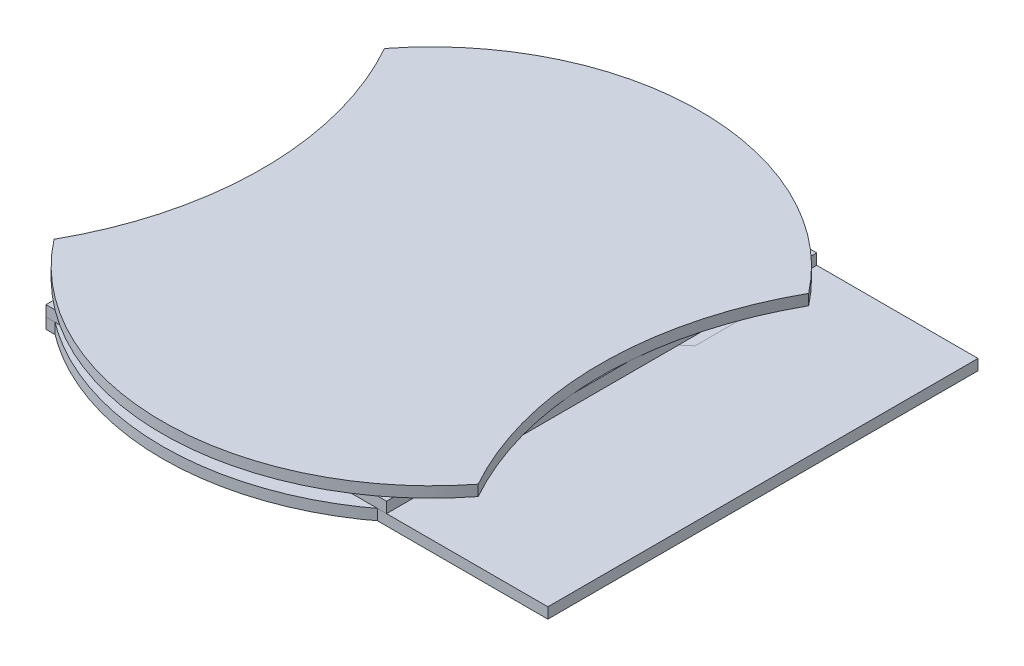
ISO-10303-21;
HEADER;
FILE_DESCRIPTION(('STEP AP214'),'2;1');
FILE_NAME('part.step','',(''),(''),'','','');
FILE_SCHEMA(('AUTOMOTIVE_DESIGN { 1 0 10303 214 1 1 1 1 }'));
ENDSEC;
DATA;
#1=APPLICATION_CONTEXT('core data for automotive mechanical design processes');
#2=APPLICATION_PROTOCOL_DEFINITION('international standard','automotive_design',2000,#1);
#3=PRODUCT_CONTEXT('',#1,'mechanical');
#4=PRODUCT('Part','Part','',(#3));
#5=PRODUCT_RELATED_PRODUCT_CATEGORY('part','',(#4));
#6=PRODUCT_DEFINITION_FORMATION('','',#4);
#7=PRODUCT_DEFINITION_CONTEXT('part definition',#1,'design');
#8=PRODUCT_DEFINITION('design','',#6,#7);
#9=PRODUCT_DEFINITION_SHAPE('','',#8);
#10=(LENGTH_UNIT() NAMED_UNIT(*) SI_UNIT(.MILLI.,.METRE.));
#11=(NAMED_UNIT(*) PLANE_ANGLE_UNIT() SI_UNIT($,.RADIAN.));
#12=(NAMED_UNIT(*) SI_UNIT($,.STERADIAN.) SOLID_ANGLE_UNIT());
#13=UNCERTAINTY_MEASURE_WITH_UNIT(LENGTH_MEASURE(1.E-05),#10,'distance_accuracy_value','');
#14=(GEOMETRIC_REPRESENTATION_CONTEXT(3) GLOBAL_UNCERTAINTY_ASSIGNED_CONTEXT((#13)) GLOBAL_UNIT_ASSIGNED_CONTEXT((#10,
#11,#12)) REPRESENTATION_CONTEXT('',''));
#15=CARTESIAN_POINT('',(0.,0.,0.));
#16=DIRECTION('',(0.,0.,1.));
#17=DIRECTION('',(1.,0.,0.));
#18=AXIS2_PLACEMENT_3D('',#15,#16,#17);
#19=CARTESIAN_POINT('',(47.5,3.,-60.));
#20=DIRECTION('',(0.,-1.,0.));
#21=DIRECTION('',(0.,0.,-1.));
#22=AXIS2_PLACEMENT_3D('',#19,#20,#21);
#23=PLANE('',#22);
#24=CARTESIAN_POINT('',(76.9611123026038,3.,-19.6014497550547));
#25=DIRECTION('',(0.,1.,0.));
#26=DIRECTION('',(0.,0.,1.));
#27=AXIS2_PLACEMENT_3D('',#24,#25,#26);
#28=CIRCLE('',#27,1.50000000000001);
#29=CARTESIAN_POINT('',(76.9611123026038,3.,-18.1014497550547));
#30=VERTEX_POINT('',#29);
#31=EDGE_CURVE('E173',#30,#30,#28,.T.);
#32=ORIENTED_EDGE('',*,*,#31,.F.);
#33=EDGE_LOOP('',(#32));
#34=FACE_BOUND('',#33,.T.);
#35=CARTESIAN_POINT('',(76.9611123026038,3.,-100.398550244945));
#36=DIRECTION('',(0.,1.,0.));
#37=DIRECTION('',(0.,0.,1.));
#38=AXIS2_PLACEMENT_3D('',#35,#36,#37);
#39=CIRCLE('',#38,1.50000000000001);
#40=CARTESIAN_POINT('',(76.9611123026038,3.,-98.8985502449453));
#41=VERTEX_POINT('',#40);
#42=EDGE_CURVE('E128',#41,#41,#39,.F.);
#43=ORIENTED_EDGE('',*,*,#42,.T.);
#44=EDGE_LOOP('',(#43));
#45=FACE_BOUND('',#44,.T.);
#46=CARTESIAN_POINT('',(87.5000000000002,3.,-15.15));
#47=DIRECTION('',(0.,1.,0.));
#48=DIRECTION('',(0.,0.,1.));
#49=AXIS2_PLACEMENT_3D('',#46,#47,#48);
#50=CIRCLE('',#49,1.50000000000001);
#51=CARTESIAN_POINT('',(87.5000000000002,3.,-13.65));
#52=VERTEX_POINT('',#51);
#53=EDGE_CURVE('E163',#52,#52,#50,.T.);
#54=ORIENTED_EDGE('',*,*,#53,.F.);
#55=EDGE_LOOP('',(#54));
#56=FACE_BOUND('',#55,.T.);
#57=CARTESIAN_POINT('',(87.5000000000002,3.,-104.85));
#58=DIRECTION('',(0.,1.,0.));
#59=DIRECTION('',(0.,0.,1.));
#60=AXIS2_PLACEMENT_3D('',#57,#58,#59);
#61=CIRCLE('',#60,1.50000000000001);
#62=CARTESIAN_POINT('',(87.5000000000002,3.,-103.35));
#63=VERTEX_POINT('',#62);
#64=EDGE_CURVE('E114',#63,#63,#61,.F.);
#65=ORIENTED_EDGE('',*,*,#64,.T.);
#66=EDGE_LOOP('',(#65));
#67=FACE_BOUND('',#66,.T.);
#68=CARTESIAN_POINT('',(47.5,3.,-60.));
#69=DIRECTION('',(0.,1.,0.));
#70=DIRECTION('',(0.,0.,1.));
#71=AXIS2_PLACEMENT_3D('',#68,#69,#70);
#72=CIRCLE('',#71,25.);
#73=CARTESIAN_POINT('',(47.5,3.,-35.));
#74=VERTEX_POINT('',#73);
#75=EDGE_CURVE('E102',#74,#74,#72,.T.);
#76=ORIENTED_EDGE('',*,*,#75,.F.);
#77=EDGE_LOOP('',(#76));
#78=FACE_BOUND('',#77,.T.);
#79=CARTESIAN_POINT('',(7.49999999999987,3.,-15.15));
#80=DIRECTION('',(0.,1.,0.));
#81=DIRECTION('',(0.,0.,1.));
#82=AXIS2_PLACEMENT_3D('',#79,#80,#81);
#83=CIRCLE('',#82,1.5);
#84=CARTESIAN_POINT('',(7.49999999999987,3.,-13.65));
#85=VERTEX_POINT('',#84);
#86=EDGE_CURVE('E166',#85,#85,#83,.F.);
#87=ORIENTED_EDGE('',*,*,#86,.T.);
#88=EDGE_LOOP('',(#87));
#89=FACE_BOUND('',#88,.T.);
#90=CARTESIAN_POINT('',(7.49999999999987,3.,-104.85));
#91=DIRECTION('',(0.,1.,0.));
#92=DIRECTION('',(0.,0.,1.));
#93=AXIS2_PLACEMENT_3D('',#90,#91,#92);
#94=CIRCLE('',#93,1.5);
#95=CARTESIAN_POINT('',(7.49999999999987,3.,-103.35));
#96=VERTEX_POINT('',#95);
#97=EDGE_CURVE('E137',#96,#96,#94,.T.);
#98=ORIENTED_EDGE('',*,*,#97,.F.);
#99=EDGE_LOOP('',(#98));
#100=FACE_BOUND('',#99,.T.);
#101=CARTESIAN_POINT('',(18.0388876973963,3.,-19.6014497550547));
#102=DIRECTION('',(0.,1.,0.));
#103=DIRECTION('',(0.,0.,1.));
#104=AXIS2_PLACEMENT_3D('',#101,#102,#103);
#105=CIRCLE('',#104,1.5);
#106=CARTESIAN_POINT('',(18.0388876973963,3.,-18.1014497550547));
#107=VERTEX_POINT('',#106);
#108=EDGE_CURVE('E176',#107,#107,#105,.F.);
#109=ORIENTED_EDGE('',*,*,#108,.T.);
#110=EDGE_LOOP('',(#109));
#111=FACE_BOUND('',#110,.T.);
#112=CARTESIAN_POINT('',(18.0388876973963,3.,-100.398550244945));
#113=DIRECTION('',(0.,1.,0.));
#114=DIRECTION('',(0.,0.,1.));
#115=AXIS2_PLACEMENT_3D('',#112,#113,#114);
#116=CIRCLE('',#115,1.5);
#117=CARTESIAN_POINT('',(18.0388876973963,3.,-98.8985502449453));
#118=VERTEX_POINT('',#117);
#119=EDGE_CURVE('E146',#118,#118,#116,.T.);
#120=ORIENTED_EDGE('',*,*,#119,.F.);
#121=EDGE_LOOP('',(#120));
#122=FACE_BOUND('',#121,.T.);
#123=DIRECTION('',(0.,0.,1.));
#124=VECTOR('',#123,1.);
#125=CARTESIAN_POINT('',(-2.49999999999997,3.,0.));
#126=LINE('',#125,#124);
#127=CARTESIAN_POINT('',(-2.49999999999997,3.,-115.901699437495));
#128=VERTEX_POINT('',#127);
#129=CARTESIAN_POINT('',(-2.49999999999997,3.,-4.09830056250528));
#130=VERTEX_POINT('',#129);
#131=EDGE_CURVE('E62',#128,#130,#126,.T.);
#132=ORIENTED_EDGE('',*,*,#131,.T.);
#133=CARTESIAN_POINT('',(47.5,3.,-60.));
#134=DIRECTION('',(0.,-1.,0.));
#135=DIRECTION('',(0.,0.,-1.));
#136=AXIS2_PLACEMENT_3D('',#133,#134,#135);
#137=CIRCLE('',#136,75.);
#138=CARTESIAN_POINT('',(97.5,3.,-4.09830056250528));
#139=VERTEX_POINT('',#138);
#140=EDGE_CURVE('E96',#139,#130,#137,.T.);
#141=ORIENTED_EDGE('',*,*,#140,.F.);
#142=DIRECTION('',(0.,0.,-1.));
#143=VECTOR('',#142,1.);
#144=CARTESIAN_POINT('',(97.5,3.,0.));
#145=LINE('',#144,#143);
#146=CARTESIAN_POINT('',(97.5,3.,-115.901699437495));
#147=VERTEX_POINT('',#146);
#148=EDGE_CURVE('E70',#139,#147,#145,.T.);
#149=ORIENTED_EDGE('',*,*,#148,.T.);
#150=EDGE_CURVE('E98',#128,#147,#137,.T.);
#151=ORIENTED_EDGE('',*,*,#150,.F.);
#152=EDGE_LOOP('',(#132,#141,#149,#151));
#153=FACE_BOUND('',#152,.T.);
#154=ADVANCED_FACE('F48',(#34,#45,#56,#67,#78,#89,#100,#111,#122,#153),#23,.F.);
#155=CARTESIAN_POINT('',(47.5,0.,-60.));
#156=DIRECTION('',(0.,-1.,0.));
#157=DIRECTION('',(0.,0.,-1.));
#158=AXIS2_PLACEMENT_3D('',#155,#156,#157);
#159=PLANE('',#158);
#160=CARTESIAN_POINT('',(18.0388876973963,0.,-19.6014497550547));
#161=DIRECTION('',(0.,-1.,0.));
#162=DIRECTION('',(0.,0.,-1.));
#163=AXIS2_PLACEMENT_3D('',#160,#161,#162);
#164=CIRCLE('',#163,1.5);
#165=CARTESIAN_POINT('',(18.0388876973963,0.,-21.1014497550547));
#166=VERTEX_POINT('',#165);
#167=EDGE_CURVE('E131',#166,#166,#164,.F.);
#168=ORIENTED_EDGE('',*,*,#167,.T.);
#169=EDGE_LOOP('',(#168));
#170=FACE_BOUND('',#169,.T.);
#171=CARTESIAN_POINT('',(76.9611123026038,0.,-100.398550244945));
#172=DIRECTION('',(0.,-1.,0.));
#173=DIRECTION('',(0.,0.,-1.));
#174=AXIS2_PLACEMENT_3D('',#171,#172,#173);
#175=CIRCLE('',#174,1.50000000000001);
#176=CARTESIAN_POINT('',(76.9611123026038,0.,-101.898550244945));
#177=VERTEX_POINT('',#176);
#178=EDGE_CURVE('E124',#177,#177,#175,.F.);
#179=ORIENTED_EDGE('',*,*,#178,.T.);
#180=EDGE_LOOP('',(#179));
#181=FACE_BOUND('',#180,.T.);
#182=CARTESIAN_POINT('',(7.49999999999987,0.,-15.15));
#183=DIRECTION('',(0.,-1.,0.));
#184=DIRECTION('',(0.,0.,-1.));
#185=AXIS2_PLACEMENT_3D('',#182,#183,#184);
#186=CIRCLE('',#185,1.5);
#187=CARTESIAN_POINT('',(7.49999999999987,0.,-16.65));
#188=VERTEX_POINT('',#187);
#189=EDGE_CURVE('E117',#188,#188,#186,.F.);
#190=ORIENTED_EDGE('',*,*,#189,.T.);
#191=EDGE_LOOP('',(#190));
#192=FACE_BOUND('',#191,.T.);
#193=CARTESIAN_POINT('',(87.5000000000002,0.,-104.85));
#194=DIRECTION('',(0.,-1.,0.));
#195=DIRECTION('',(0.,0.,-1.));
#196=AXIS2_PLACEMENT_3D('',#193,#194,#195);
#197=CIRCLE('',#196,1.50000000000001);
#198=CARTESIAN_POINT('',(87.5000000000002,0.,-106.35));
#199=VERTEX_POINT('',#198);
#200=EDGE_CURVE('E110',#199,#199,#197,.F.);
#201=ORIENTED_EDGE('',*,*,#200,.T.);
#202=EDGE_LOOP('',(#201));
#203=FACE_BOUND('',#202,.T.);
#204=CARTESIAN_POINT('',(87.5000000000002,0.,-15.15));
#205=DIRECTION('',(0.,-1.,0.));
#206=DIRECTION('',(0.,0.,-1.));
#207=AXIS2_PLACEMENT_3D('',#204,#205,#206);
#208=CIRCLE('',#207,1.50000000000001);
#209=CARTESIAN_POINT('',(87.5000000000002,0.,-16.65));
#210=VERTEX_POINT('',#209);
#211=EDGE_CURVE('E113',#210,#210,#208,.T.);
#212=ORIENTED_EDGE('',*,*,#211,.F.);
#213=EDGE_LOOP('',(#212));
#214=FACE_BOUND('',#213,.T.);
#215=CARTESIAN_POINT('',(7.49999999999987,0.,-104.85));
#216=DIRECTION('',(0.,-1.,0.));
#217=DIRECTION('',(0.,0.,-1.));
#218=AXIS2_PLACEMENT_3D('',#215,#216,#217);
#219=CIRCLE('',#218,1.5);
#220=CARTESIAN_POINT('',(7.49999999999987,0.,-106.35));
#221=VERTEX_POINT('',#220);
#222=EDGE_CURVE('E120',#221,#221,#219,.T.);
#223=ORIENTED_EDGE('',*,*,#222,.F.);
#224=EDGE_LOOP('',(#223));
#225=FACE_BOUND('',#224,.T.);
#226=CARTESIAN_POINT('',(76.9611123026038,0.,-19.6014497550547));
#227=DIRECTION('',(0.,-1.,0.));
#228=DIRECTION('',(0.,0.,-1.));
#229=AXIS2_PLACEMENT_3D('',#226,#227,#228);
#230=CIRCLE('',#229,1.50000000000001);
#231=CARTESIAN_POINT('',(76.9611123026038,0.,-21.1014497550547));
#232=VERTEX_POINT('',#231);
#233=EDGE_CURVE('E127',#232,#232,#230,.T.);
#234=ORIENTED_EDGE('',*,*,#233,.F.);
#235=EDGE_LOOP('',(#234));
#236=FACE_BOUND('',#235,.T.);
#237=CARTESIAN_POINT('',(18.0388876973963,0.,-100.398550244945));
#238=DIRECTION('',(0.,-1.,0.));
#239=DIRECTION('',(0.,0.,-1.));
#240=AXIS2_PLACEMENT_3D('',#237,#238,#239);
#241=CIRCLE('',#240,1.5);
#242=CARTESIAN_POINT('',(18.0388876973963,0.,-101.898550244945));
#243=VERTEX_POINT('',#242);
#244=EDGE_CURVE('E134',#243,#243,#241,.T.);
#245=ORIENTED_EDGE('',*,*,#244,.F.);
#246=EDGE_LOOP('',(#245));
#247=FACE_BOUND('',#246,.T.);
#248=CARTESIAN_POINT('',(47.5,0.,-60.));
#249=DIRECTION('',(0.,-1.,0.));
#250=DIRECTION('',(0.,0.,-1.));
#251=AXIS2_PLACEMENT_3D('',#248,#249,#250);
#252=CIRCLE('',#251,75.);
#253=CARTESIAN_POINT('',(97.5,0.,-4.09830056250528));
#254=VERTEX_POINT('',#253);
#255=CARTESIAN_POINT('',(-2.49999999999997,0.,-4.09830056250528));
#256=VERTEX_POINT('',#255);
#257=EDGE_CURVE('E106',#254,#256,#252,.T.);
#258=ORIENTED_EDGE('',*,*,#257,.T.);
#259=DIRECTION('',(0.,0.,-1.));
#260=VECTOR('',#259,1.);
#261=CARTESIAN_POINT('',(-2.49999999999997,0.,-60.));
#262=LINE('',#261,#260);
#263=CARTESIAN_POINT('',(-2.49999999999997,0.,-115.901699437495));
#264=VERTEX_POINT('',#263);
#265=EDGE_CURVE('E88',#256,#264,#262,.T.);
#266=ORIENTED_EDGE('',*,*,#265,.T.);
#267=CARTESIAN_POINT('',(97.5,0.,-115.901699437495));
#268=VERTEX_POINT('',#267);
#269=EDGE_CURVE('E109',#264,#268,#252,.T.);
#270=ORIENTED_EDGE('',*,*,#269,.T.);
#271=DIRECTION('',(0.,0.,1.));
#272=VECTOR('',#271,1.);
#273=CARTESIAN_POINT('',(97.5,0.,-60.));
#274=LINE('',#273,#272);
#275=EDGE_CURVE('E99',#268,#254,#274,.T.);
#276=ORIENTED_EDGE('',*,*,#275,.T.);
#277=EDGE_LOOP('',(#258,#266,#270,#276));
#278=FACE_BOUND('',#277,.T.);
#279=ADVANCED_FACE('F144',(#170,#181,#192,#203,#214,#225,#236,#247,#278),#159,.T.);
#280=CARTESIAN_POINT('',(47.5,0.,-60.));
#281=DIRECTION('',(0.,1.,0.));
#282=DIRECTION('',(0.,0.,1.));
#283=AXIS2_PLACEMENT_3D('',#280,#281,#282);
#284=CYLINDRICAL_SURFACE('',#283,75.);
#285=DIRECTION('',(0.,1.,0.));
#286=VECTOR('',#285,1.);
#287=CARTESIAN_POINT('',(-2.49999999999997,0.,-4.09830056250528));
#288=LINE('',#287,#286);
#289=EDGE_CURVE('E12',#256,#130,#288,.T.);
#290=ORIENTED_EDGE('',*,*,#289,.F.);
#291=ORIENTED_EDGE('',*,*,#257,.F.);
#292=DIRECTION('',(0.,1.,0.));
#293=VECTOR('',#292,1.);
#294=CARTESIAN_POINT('',(97.5,0.,-4.09830056250528));
#295=LINE('',#294,#293);
#296=EDGE_CURVE('E101',#139,#254,#295,.F.);
#297=ORIENTED_EDGE('',*,*,#296,.F.);
#298=ORIENTED_EDGE('',*,*,#140,.T.);
#299=EDGE_LOOP('',(#290,#291,#297,#298));
#300=FACE_BOUND('',#299,.T.);
#301=ADVANCED_FACE('F50',(#300),#284,.T.);
#302=DIRECTION('',(0.,1.,0.));
#303=VECTOR('',#302,1.);
#304=CARTESIAN_POINT('',(-2.49999999999997,0.,-115.901699437495));
#305=LINE('',#304,#303);
#306=EDGE_CURVE('E56',#128,#264,#305,.F.);
#307=ORIENTED_EDGE('',*,*,#306,.F.);
#308=ORIENTED_EDGE('',*,*,#150,.T.);
#309=DIRECTION('',(0.,1.,0.));
#310=VECTOR('',#309,1.);
#311=CARTESIAN_POINT('',(97.5,0.,-115.901699437495));
#312=LINE('',#311,#310);
#313=EDGE_CURVE('E139',#268,#147,#312,.T.);
#314=ORIENTED_EDGE('',*,*,#313,.F.);
#315=ORIENTED_EDGE('',*,*,#269,.F.);
#316=EDGE_LOOP('',(#307,#308,#314,#315));
#317=FACE_BOUND('',#316,.T.);
#318=ADVANCED_FACE('F149',(#317),#284,.T.);
#319=CARTESIAN_POINT('',(47.5,8.,-60.));
#320=DIRECTION('',(0.,1.,0.));
#321=DIRECTION('',(0.,0.,1.));
#322=AXIS2_PLACEMENT_3D('',#319,#320,#321);
#323=PLANE('',#322);
#324=CARTESIAN_POINT('',(47.5,8.,-60.));
#325=DIRECTION('',(0.,1.,0.));
#326=DIRECTION('',(0.,0.,1.));
#327=AXIS2_PLACEMENT_3D('',#324,#325,#326);
#328=CIRCLE('',#327,25.);
#329=CARTESIAN_POINT('',(47.5,8.,-35.));
#330=VERTEX_POINT('',#329);
#331=EDGE_CURVE('E150',#330,#330,#328,.T.);
#332=ORIENTED_EDGE('',*,*,#331,.T.);
#333=EDGE_LOOP('',(#332));
#334=FACE_BOUND('',#333,.T.);
#335=CARTESIAN_POINT('',(47.5,8.,-60.));
#336=DIRECTION('',(0.,1.,0.));
#337=DIRECTION('',(0.,0.,1.));
#338=AXIS2_PLACEMENT_3D('',#335,#336,#337);
#339=CIRCLE('',#338,8.35);
#340=CARTESIAN_POINT('',(47.5,8.,-51.65));
#341=VERTEX_POINT('',#340);
#342=EDGE_CURVE('E152',#341,#341,#339,.T.);
#343=ORIENTED_EDGE('',*,*,#342,.F.);
#344=EDGE_LOOP('',(#343));
#345=FACE_BOUND('',#344,.T.);
#346=ADVANCED_FACE('F224',(#334,#345),#323,.T.);
#347=CARTESIAN_POINT('',(47.5,8.,-60.));
#348=DIRECTION('',(0.,-1.,0.));
#349=DIRECTION('',(0.,0.,-1.));
#350=AXIS2_PLACEMENT_3D('',#347,#348,#349);
#351=CYLINDRICAL_SURFACE('',#350,25.);
#352=ORIENTED_EDGE('',*,*,#331,.F.);
#353=EDGE_LOOP('',(#352));
#354=FACE_BOUND('',#353,.T.);
#355=ORIENTED_EDGE('',*,*,#75,.T.);
#356=EDGE_LOOP('',(#355));
#357=FACE_BOUND('',#356,.T.);
#358=ADVANCED_FACE('F216',(#354,#357),#351,.T.);
#359=CARTESIAN_POINT('',(47.5,8.,-60.));
#360=DIRECTION('',(0.,-1.,0.));
#361=DIRECTION('',(0.,0.,-1.));
#362=AXIS2_PLACEMENT_3D('',#359,#360,#361);
#363=CYLINDRICAL_SURFACE('',#362,8.35);
#364=ORIENTED_EDGE('',*,*,#342,.T.);
#365=EDGE_LOOP('',(#364));
#366=FACE_BOUND('',#365,.T.);
#367=CARTESIAN_POINT('',(47.5,3.,-60.));
#368=DIRECTION('',(0.,1.,0.));
#369=DIRECTION('',(0.,0.,1.));
#370=AXIS2_PLACEMENT_3D('',#367,#368,#369);
#371=CIRCLE('',#370,8.35);
#372=CARTESIAN_POINT('',(47.5,3.,-51.65));
#373=VERTEX_POINT('',#372);
#374=EDGE_CURVE('E123',#373,#373,#371,.T.);
#375=ORIENTED_EDGE('',*,*,#374,.F.);
#376=EDGE_LOOP('',(#375));
#377=FACE_BOUND('',#376,.T.);
#378=ADVANCED_FACE('F207',(#366,#377),#363,.F.);
#379=ORIENTED_EDGE('',*,*,#374,.T.);
#380=EDGE_LOOP('',(#379));
#381=FACE_BOUND('',#380,.T.);
#382=ADVANCED_FACE('F197',(#381),#23,.F.);
#383=CARTESIAN_POINT('',(87.5000000000002,-7.,-104.85));
#384=DIRECTION('',(0.,1.,0.));
#385=DIRECTION('',(0.,0.,1.));
#386=AXIS2_PLACEMENT_3D('',#383,#384,#385);
#387=CYLINDRICAL_SURFACE('',#386,1.50000000000001);
#388=ORIENTED_EDGE('',*,*,#200,.F.);
#389=EDGE_LOOP('',(#388));
#390=FACE_BOUND('',#389,.T.);
#391=ORIENTED_EDGE('',*,*,#64,.F.);
#392=EDGE_LOOP('',(#391));
#393=FACE_BOUND('',#392,.T.);
#394=ADVANCED_FACE('F206',(#390,#393),#387,.F.);
#395=CARTESIAN_POINT('',(87.5000000000002,-7.,-15.15));
#396=DIRECTION('',(0.,1.,0.));
#397=DIRECTION('',(0.,0.,1.));
#398=AXIS2_PLACEMENT_3D('',#395,#396,#397);
#399=CYLINDRICAL_SURFACE('',#398,1.50000000000001);
#400=ORIENTED_EDGE('',*,*,#211,.T.);
#401=EDGE_LOOP('',(#400));
#402=FACE_BOUND('',#401,.T.);
#403=ORIENTED_EDGE('',*,*,#53,.T.);
#404=EDGE_LOOP('',(#403));
#405=FACE_BOUND('',#404,.T.);
#406=ADVANCED_FACE('F213',(#402,#405),#399,.F.);
#407=CARTESIAN_POINT('',(7.49999999999987,-7.,-15.15));
#408=DIRECTION('',(0.,1.,0.));
#409=DIRECTION('',(0.,0.,1.));
#410=AXIS2_PLACEMENT_3D('',#407,#408,#409);
#411=CYLINDRICAL_SURFACE('',#410,1.5);
#412=ORIENTED_EDGE('',*,*,#189,.F.);
#413=EDGE_LOOP('',(#412));
#414=FACE_BOUND('',#413,.T.);
#415=ORIENTED_EDGE('',*,*,#86,.F.);
#416=EDGE_LOOP('',(#415));
#417=FACE_BOUND('',#416,.T.);
#418=ADVANCED_FACE('F297',(#414,#417),#411,.F.);
#419=CARTESIAN_POINT('',(7.49999999999987,-7.,-104.85));
#420=DIRECTION('',(0.,1.,0.));
#421=DIRECTION('',(0.,0.,1.));
#422=AXIS2_PLACEMENT_3D('',#419,#420,#421);
#423=CYLINDRICAL_SURFACE('',#422,1.5);
#424=ORIENTED_EDGE('',*,*,#222,.T.);
#425=EDGE_LOOP('',(#424));
#426=FACE_BOUND('',#425,.T.);
#427=ORIENTED_EDGE('',*,*,#97,.T.);
#428=EDGE_LOOP('',(#427));
#429=FACE_BOUND('',#428,.T.);
#430=ADVANCED_FACE('F287',(#426,#429),#423,.F.);
#431=CARTESIAN_POINT('',(76.9611123026038,-7.,-100.398550244945));
#432=DIRECTION('',(0.,1.,0.));
#433=DIRECTION('',(0.,0.,1.));
#434=AXIS2_PLACEMENT_3D('',#431,#432,#433);
#435=CYLINDRICAL_SURFACE('',#434,1.50000000000001);
#436=ORIENTED_EDGE('',*,*,#178,.F.);
#437=EDGE_LOOP('',(#436));
#438=FACE_BOUND('',#437,.T.);
#439=ORIENTED_EDGE('',*,*,#42,.F.);
#440=EDGE_LOOP('',(#439));
#441=FACE_BOUND('',#440,.T.);
#442=ADVANCED_FACE('F278',(#438,#441),#435,.F.);
#443=CARTESIAN_POINT('',(76.9611123026038,-7.,-19.6014497550547));
#444=DIRECTION('',(0.,1.,0.));
#445=DIRECTION('',(0.,0.,1.));
#446=AXIS2_PLACEMENT_3D('',#443,#444,#445);
#447=CYLINDRICAL_SURFACE('',#446,1.50000000000001);
#448=ORIENTED_EDGE('',*,*,#233,.T.);
#449=EDGE_LOOP('',(#448));
#450=FACE_BOUND('',#449,.T.);
#451=ORIENTED_EDGE('',*,*,#31,.T.);
#452=EDGE_LOOP('',(#451));
#453=FACE_BOUND('',#452,.T.);
#454=ADVANCED_FACE('F268',(#450,#453),#447,.F.);
#455=CARTESIAN_POINT('',(18.0388876973963,-7.,-19.6014497550547));
#456=DIRECTION('',(0.,1.,0.));
#457=DIRECTION('',(0.,0.,1.));
#458=AXIS2_PLACEMENT_3D('',#455,#456,#457);
#459=CYLINDRICAL_SURFACE('',#458,1.5);
#460=ORIENTED_EDGE('',*,*,#167,.F.);
#461=EDGE_LOOP('',(#460));
#462=FACE_BOUND('',#461,.T.);
#463=ORIENTED_EDGE('',*,*,#108,.F.);
#464=EDGE_LOOP('',(#463));
#465=FACE_BOUND('',#464,.T.);
#466=ADVANCED_FACE('F191',(#462,#465),#459,.F.);
#467=CARTESIAN_POINT('',(18.0388876973963,-7.,-100.398550244945));
#468=DIRECTION('',(0.,1.,0.));
#469=DIRECTION('',(0.,0.,1.));
#470=AXIS2_PLACEMENT_3D('',#467,#468,#469);
#471=CYLINDRICAL_SURFACE('',#470,1.5);
#472=ORIENTED_EDGE('',*,*,#244,.T.);
#473=EDGE_LOOP('',(#472));
#474=FACE_BOUND('',#473,.T.);
#475=ORIENTED_EDGE('',*,*,#119,.T.);
#476=EDGE_LOOP('',(#475));
#477=FACE_BOUND('',#476,.T.);
#478=ADVANCED_FACE('F184',(#474,#477),#471,.F.);
#479=CARTESIAN_POINT('',(97.5,-7.,0.));
#480=DIRECTION('',(1.,0.,0.));
#481=DIRECTION('',(0.,0.,-1.));
#482=AXIS2_PLACEMENT_3D('',#479,#480,#481);
#483=PLANE('',#482);
#484=ORIENTED_EDGE('',*,*,#313,.T.);
#485=ORIENTED_EDGE('',*,*,#148,.F.);
#486=ORIENTED_EDGE('',*,*,#296,.T.);
#487=ORIENTED_EDGE('',*,*,#275,.F.);
#488=EDGE_LOOP('',(#484,#485,#486,#487));
#489=FACE_BOUND('',#488,.T.);
#490=ADVANCED_FACE('F182',(#489),#483,.T.);
#491=CARTESIAN_POINT('',(-2.49999999999997,-7.,0.));
#492=DIRECTION('',(-1.,0.,0.));
#493=DIRECTION('',(0.,0.,1.));
#494=AXIS2_PLACEMENT_3D('',#491,#492,#493);
#495=PLANE('',#494);
#496=ORIENTED_EDGE('',*,*,#289,.T.);
#497=ORIENTED_EDGE('',*,*,#131,.F.);
#498=ORIENTED_EDGE('',*,*,#306,.T.);
#499=ORIENTED_EDGE('',*,*,#265,.F.);
#500=EDGE_LOOP('',(#496,#497,#498,#499));
#501=FACE_BOUND('',#500,.T.);
#502=ADVANCED_FACE('F86',(#501),#495,.T.);
#503=CLOSED_SHELL('',(#154,#279,#301,#318,#346,#358,#378,#382,#394,#406,#418,#430,#442,#454,
#466,#478,#490,#502));
#504=MANIFOLD_SOLID_BREP('B2',#503);
#505=CARTESIAN_POINT('',(47.5,9.,-60.));
#506=DIRECTION('',(0.,-1.,0.));
#507=DIRECTION('',(0.,0.,-1.));
#508=AXIS2_PLACEMENT_3D('',#505,#506,#507);
#509=CYLINDRICAL_SURFACE('',#508,75.);
#510=CARTESIAN_POINT('',(47.5,6.,-60.));
#511=DIRECTION('',(0.,1.,0.));
#512=DIRECTION('',(0.,0.,1.));
#513=AXIS2_PLACEMENT_3D('',#510,#511,#512);
#514=CIRCLE('',#513,75.);
#515=CARTESIAN_POINT('',(106.66,6.,-106.098746186854));
#516=VERTEX_POINT('',#515);
#517=CARTESIAN_POINT('',(-11.66,6.,-106.098746186854));
#518=VERTEX_POINT('',#517);
#519=EDGE_CURVE('E504',#516,#518,#514,.T.);
#520=ORIENTED_EDGE('',*,*,#519,.T.);
#521=DIRECTION('',(0.,1.,0.));
#522=VECTOR('',#521,1.);
#523=CARTESIAN_POINT('',(-11.66,0.,-106.098746186854));
#524=LINE('',#523,#522);
#525=CARTESIAN_POINT('',(-11.66,9.,-106.098746186854));
#526=VERTEX_POINT('',#525);
#527=EDGE_CURVE('E463',#518,#526,#524,.T.);
#528=ORIENTED_EDGE('',*,*,#527,.T.);
#529=CARTESIAN_POINT('',(47.5,9.,-60.));
#530=DIRECTION('',(0.,1.,0.));
#531=DIRECTION('',(0.,0.,1.));
#532=AXIS2_PLACEMENT_3D('',#529,#530,#531);
#533=CIRCLE('',#532,75.);
#534=CARTESIAN_POINT('',(106.66,9.,-106.098746186854));
#535=VERTEX_POINT('',#534);
#536=EDGE_CURVE('E502',#535,#526,#533,.T.);
#537=ORIENTED_EDGE('',*,*,#536,.F.);
#538=DIRECTION('',(0.,1.,0.));
#539=VECTOR('',#538,1.);
#540=CARTESIAN_POINT('',(106.66,0.,-106.098746186854));
#541=LINE('',#540,#539);
#542=EDGE_CURVE('E510',#516,#535,#541,.T.);
#543=ORIENTED_EDGE('',*,*,#542,.F.);
#544=EDGE_LOOP('',(#520,#528,#537,#543));
#545=FACE_BOUND('',#544,.T.);
#546=ADVANCED_FACE('F448',(#545),#509,.T.);
#547=CARTESIAN_POINT('',(-11.66,9.,-13.9012538131458));
#548=VERTEX_POINT('',#547);
#549=CARTESIAN_POINT('',(106.66,9.,-13.9012538131458));
#550=VERTEX_POINT('',#549);
#551=EDGE_CURVE('E500',#548,#550,#533,.T.);
#552=ORIENTED_EDGE('',*,*,#551,.F.);
#553=DIRECTION('',(0.,1.,0.));
#554=VECTOR('',#553,1.);
#555=CARTESIAN_POINT('',(-11.66,0.,-13.9012538131458));
#556=LINE('',#555,#554);
#557=CARTESIAN_POINT('',(-11.66,6.,-13.9012538131458));
#558=VERTEX_POINT('',#557);
#559=EDGE_CURVE('E486',#558,#548,#556,.T.);
#560=ORIENTED_EDGE('',*,*,#559,.F.);
#561=CARTESIAN_POINT('',(106.66,6.,-13.9012538131458));
#562=VERTEX_POINT('',#561);
#563=EDGE_CURVE('E507',#558,#562,#514,.T.);
#564=ORIENTED_EDGE('',*,*,#563,.T.);
#565=DIRECTION('',(0.,1.,0.));
#566=VECTOR('',#565,1.);
#567=CARTESIAN_POINT('',(106.66,0.,-13.9012538131458));
#568=LINE('',#567,#566);
#569=EDGE_CURVE('E470',#562,#550,#568,.T.);
#570=ORIENTED_EDGE('',*,*,#569,.T.);
#571=EDGE_LOOP('',(#552,#560,#564,#570));
#572=FACE_BOUND('',#571,.T.);
#573=ADVANCED_FACE('F450',(#572),#509,.T.);
#574=CARTESIAN_POINT('',(47.5,9.,-60.));
#575=DIRECTION('',(0.,1.,0.));
#576=DIRECTION('',(0.,0.,1.));
#577=AXIS2_PLACEMENT_3D('',#574,#575,#576);
#578=PLANE('',#577);
#579=CARTESIAN_POINT('',(-94.126810840622,9.,-60.));
#580=DIRECTION('',(0.,1.,0.));
#581=DIRECTION('',(0.,0.,-1.));
#582=AXIS2_PLACEMENT_3D('',#579,#580,#581);
#583=CIRCLE('',#582,94.4768187981736);
#584=EDGE_CURVE('E489',#548,#526,#583,.T.);
#585=ORIENTED_EDGE('',*,*,#584,.F.);
#586=ORIENTED_EDGE('',*,*,#551,.T.);
#587=CARTESIAN_POINT('',(189.126810840622,9.,-60.));
#588=DIRECTION('',(0.,1.,0.));
#589=DIRECTION('',(0.,0.,1.));
#590=AXIS2_PLACEMENT_3D('',#587,#588,#589);
#591=CIRCLE('',#590,94.4768187981736);
#592=EDGE_CURVE('E518',#535,#550,#591,.T.);
#593=ORIENTED_EDGE('',*,*,#592,.F.);
#594=ORIENTED_EDGE('',*,*,#536,.T.);
#595=EDGE_LOOP('',(#585,#586,#593,#594));
#596=FACE_BOUND('',#595,.T.);
#597=ADVANCED_FACE('F498',(#596),#578,.T.);
#598=CARTESIAN_POINT('',(47.5,6.,-60.));
#599=DIRECTION('',(0.,1.,0.));
#600=DIRECTION('',(0.,0.,1.));
#601=AXIS2_PLACEMENT_3D('',#598,#599,#600);
#602=PLANE('',#601);
#603=ORIENTED_EDGE('',*,*,#563,.F.);
#604=CARTESIAN_POINT('',(-94.126810840622,6.,-60.));
#605=DIRECTION('',(0.,1.,0.));
#606=DIRECTION('',(0.,0.,1.));
#607=AXIS2_PLACEMENT_3D('',#604,#605,#606);
#608=CIRCLE('',#607,94.4768187981736);
#609=EDGE_CURVE('E46',#558,#518,#608,.T.);
#610=ORIENTED_EDGE('',*,*,#609,.T.);
#611=ORIENTED_EDGE('',*,*,#519,.F.);
#612=CARTESIAN_POINT('',(189.126810840622,6.,-60.));
#613=DIRECTION('',(0.,1.,0.));
#614=DIRECTION('',(0.,0.,1.));
#615=AXIS2_PLACEMENT_3D('',#612,#613,#614);
#616=CIRCLE('',#615,94.4768187981736);
#617=EDGE_CURVE('E456',#516,#562,#616,.T.);
#618=ORIENTED_EDGE('',*,*,#617,.T.);
#619=EDGE_LOOP('',(#603,#610,#611,#618));
#620=FACE_BOUND('',#619,.T.);
#621=ADVANCED_FACE('F514',(#620),#602,.F.);
#622=CARTESIAN_POINT('',(189.126810840622,0.,-60.));
#623=DIRECTION('',(0.,1.,0.));
#624=DIRECTION('',(0.,0.,1.));
#625=AXIS2_PLACEMENT_3D('',#622,#623,#624);
#626=CYLINDRICAL_SURFACE('',#625,94.4768187981736);
#627=ORIENTED_EDGE('',*,*,#542,.T.);
#628=ORIENTED_EDGE('',*,*,#592,.T.);
#629=ORIENTED_EDGE('',*,*,#569,.F.);
#630=ORIENTED_EDGE('',*,*,#617,.F.);
#631=EDGE_LOOP('',(#627,#628,#629,#630));
#632=FACE_BOUND('',#631,.T.);
#633=ADVANCED_FACE('F516',(#632),#626,.F.);
#634=CARTESIAN_POINT('',(-94.126810840622,0.,-60.));
#635=DIRECTION('',(0.,1.,0.));
#636=DIRECTION('',(0.,0.,1.));
#637=AXIS2_PLACEMENT_3D('',#634,#635,#636);
#638=CYLINDRICAL_SURFACE('',#637,94.4768187981736);
#639=ORIENTED_EDGE('',*,*,#559,.T.);
#640=ORIENTED_EDGE('',*,*,#584,.T.);
#641=ORIENTED_EDGE('',*,*,#527,.F.);
#642=ORIENTED_EDGE('',*,*,#609,.F.);
#643=EDGE_LOOP('',(#639,#640,#641,#642));
#644=FACE_BOUND('',#643,.T.);
#645=ADVANCED_FACE('F488',(#644),#638,.F.);
#646=CLOSED_SHELL('',(#546,#573,#597,#621,#633,#645));
#647=MANIFOLD_SOLID_BREP('B6_NOT_SHOWN',#646);
#648=CARTESIAN_POINT('',(0.,6.,-120.));
#649=DIRECTION('',(1.,0.,0.));
#650=DIRECTION('',(0.,0.,-1.));
#651=AXIS2_PLACEMENT_3D('',#648,#649,#650);
#652=PLANE('',#651);
#653=DIRECTION('',(0.,0.,1.));
#654=VECTOR('',#653,1.);
#655=CARTESIAN_POINT('',(0.,3.,-120.));
#656=LINE('',#655,#654);
#657=CARTESIAN_POINT('',(0.,3.,-120.));
#658=VERTEX_POINT('',#657);
#659=CARTESIAN_POINT('',(0.,3.,0.));
#660=VERTEX_POINT('',#659);
#661=EDGE_CURVE('E641',#658,#660,#656,.T.);
#662=ORIENTED_EDGE('',*,*,#661,.T.);
#663=DIRECTION('',(0.,-1.,0.));
#664=VECTOR('',#663,1.);
#665=CARTESIAN_POINT('',(0.,6.,0.));
#666=LINE('',#665,#664);
#667=CARTESIAN_POINT('',(0.,6.,0.));
#668=VERTEX_POINT('',#667);
#669=EDGE_CURVE('E446',#668,#660,#666,.T.);
#670=ORIENTED_EDGE('',*,*,#669,.F.);
#671=DIRECTION('',(0.,0.,1.));
#672=VECTOR('',#671,1.);
#673=CARTESIAN_POINT('',(0.,6.,-120.));
#674=LINE('',#673,#672);
#675=CARTESIAN_POINT('',(0.,6.,-120.));
#676=VERTEX_POINT('',#675);
#677=EDGE_CURVE('E629',#676,#668,#674,.T.);
#678=ORIENTED_EDGE('',*,*,#677,.F.);
#679=DIRECTION('',(0.,-1.,0.));
#680=VECTOR('',#679,1.);
#681=CARTESIAN_POINT('',(0.,6.,-120.));
#682=LINE('',#681,#680);
#683=EDGE_CURVE('E637',#676,#658,#682,.T.);
#684=ORIENTED_EDGE('',*,*,#683,.T.);
#685=EDGE_LOOP('',(#662,#670,#678,#684));
#686=FACE_BOUND('',#685,.T.);
#687=ADVANCED_FACE('F578',(#686),#652,.F.);
#688=CARTESIAN_POINT('',(0.,6.,0.));
#689=DIRECTION('',(0.,0.,-1.));
#690=DIRECTION('',(-1.,0.,0.));
#691=AXIS2_PLACEMENT_3D('',#688,#689,#690);
#692=PLANE('',#691);
#693=DIRECTION('',(1.,0.,0.));
#694=VECTOR('',#693,1.);
#695=CARTESIAN_POINT('',(0.,3.,0.));
#696=LINE('',#695,#694);
#697=CARTESIAN_POINT('',(95.,3.,0.));
#698=VERTEX_POINT('',#697);
#699=EDGE_CURVE('E633',#660,#698,#696,.T.);
#700=ORIENTED_EDGE('',*,*,#699,.T.);
#701=DIRECTION('',(0.,-1.,0.));
#702=VECTOR('',#701,1.);
#703=CARTESIAN_POINT('',(95.,6.,0.));
#704=LINE('',#703,#702);
#705=CARTESIAN_POINT('',(95.,6.,0.));
#706=VERTEX_POINT('',#705);
#707=EDGE_CURVE('E586',#706,#698,#704,.T.);
#708=ORIENTED_EDGE('',*,*,#707,.F.);
#709=DIRECTION('',(1.,0.,0.));
#710=VECTOR('',#709,1.);
#711=CARTESIAN_POINT('',(0.,6.,0.));
#712=LINE('',#711,#710);
#713=EDGE_CURVE('E624',#668,#706,#712,.T.);
#714=ORIENTED_EDGE('',*,*,#713,.F.);
#715=ORIENTED_EDGE('',*,*,#669,.T.);
#716=EDGE_LOOP('',(#700,#708,#714,#715));
#717=FACE_BOUND('',#716,.T.);
#718=ADVANCED_FACE('F632',(#717),#692,.F.);
#719=CARTESIAN_POINT('',(95.,6.,-120.));
#720=DIRECTION('',(-1.,0.,0.));
#721=DIRECTION('',(0.,0.,1.));
#722=AXIS2_PLACEMENT_3D('',#719,#720,#721);
#723=PLANE('',#722);
#724=DIRECTION('',(0.,0.,-1.));
#725=VECTOR('',#724,1.);
#726=CARTESIAN_POINT('',(95.,3.,-120.));
#727=LINE('',#726,#725);
#728=CARTESIAN_POINT('',(95.,3.,-120.));
#729=VERTEX_POINT('',#728);
#730=EDGE_CURVE('E611',#698,#729,#727,.T.);
#731=ORIENTED_EDGE('',*,*,#730,.T.);
#732=DIRECTION('',(0.,-1.,0.));
#733=VECTOR('',#732,1.);
#734=CARTESIAN_POINT('',(95.,6.,-120.));
#735=LINE('',#734,#733);
#736=CARTESIAN_POINT('',(95.,6.,-120.));
#737=VERTEX_POINT('',#736);
#738=EDGE_CURVE('E634',#737,#729,#735,.T.);
#739=ORIENTED_EDGE('',*,*,#738,.F.);
#740=DIRECTION('',(0.,0.,-1.));
#741=VECTOR('',#740,1.);
#742=CARTESIAN_POINT('',(95.,6.,-120.));
#743=LINE('',#742,#741);
#744=EDGE_CURVE('E627',#706,#737,#743,.T.);
#745=ORIENTED_EDGE('',*,*,#744,.F.);
#746=ORIENTED_EDGE('',*,*,#707,.T.);
#747=EDGE_LOOP('',(#731,#739,#745,#746));
#748=FACE_BOUND('',#747,.T.);
#749=ADVANCED_FACE('F635',(#748),#723,.F.);
#750=CARTESIAN_POINT('',(0.,6.,-120.));
#751=DIRECTION('',(0.,0.,1.));
#752=DIRECTION('',(1.,0.,0.));
#753=AXIS2_PLACEMENT_3D('',#750,#751,#752);
#754=PLANE('',#753);
#755=DIRECTION('',(-1.,0.,0.));
#756=VECTOR('',#755,1.);
#757=CARTESIAN_POINT('',(0.,3.,-120.));
#758=LINE('',#757,#756);
#759=EDGE_CURVE('E617',#729,#658,#758,.T.);
#760=ORIENTED_EDGE('',*,*,#759,.T.);
#761=ORIENTED_EDGE('',*,*,#683,.F.);
#762=DIRECTION('',(-1.,0.,0.));
#763=VECTOR('',#762,1.);
#764=CARTESIAN_POINT('',(0.,6.,-120.));
#765=LINE('',#764,#763);
#766=EDGE_CURVE('E594',#737,#676,#765,.T.);
#767=ORIENTED_EDGE('',*,*,#766,.F.);
#768=ORIENTED_EDGE('',*,*,#738,.T.);
#769=EDGE_LOOP('',(#760,#761,#767,#768));
#770=FACE_BOUND('',#769,.T.);
#771=ADVANCED_FACE('F648',(#770),#754,.F.);
#772=CARTESIAN_POINT('',(0.,6.,0.));
#773=DIRECTION('',(0.,1.,0.));
#774=DIRECTION('',(0.,0.,1.));
#775=AXIS2_PLACEMENT_3D('',#772,#773,#774);
#776=PLANE('',#775);
#777=ORIENTED_EDGE('',*,*,#677,.T.);
#778=ORIENTED_EDGE('',*,*,#713,.T.);
#779=ORIENTED_EDGE('',*,*,#744,.T.);
#780=ORIENTED_EDGE('',*,*,#766,.T.);
#781=EDGE_LOOP('',(#777,#778,#779,#780));
#782=FACE_BOUND('',#781,.T.);
#783=ADVANCED_FACE('F625',(#782),#776,.T.);
#784=CARTESIAN_POINT('',(0.,3.,0.));
#785=DIRECTION('',(0.,1.,0.));
#786=DIRECTION('',(0.,0.,1.));
#787=AXIS2_PLACEMENT_3D('',#784,#785,#786);
#788=PLANE('',#787);
#789=ORIENTED_EDGE('',*,*,#661,.F.);
#790=ORIENTED_EDGE('',*,*,#759,.F.);
#791=ORIENTED_EDGE('',*,*,#730,.F.);
#792=ORIENTED_EDGE('',*,*,#699,.F.);
#793=EDGE_LOOP('',(#789,#790,#791,#792));
#794=FACE_BOUND('',#793,.T.);
#795=ADVANCED_FACE('F651',(#794),#788,.F.);
#796=CLOSED_SHELL('',(#687,#718,#749,#771,#783,#795));
#797=MANIFOLD_SOLID_BREP('B40_NOT_SHOWN',#796);
#798=CARTESIAN_POINT('',(0.,3.,0.));
#799=DIRECTION('',(1.,0.,0.));
#800=DIRECTION('',(0.,0.,-1.));
#801=AXIS2_PLACEMENT_3D('',#798,#799,#800);
#802=PLANE('',#801);
#803=DIRECTION('',(0.,0.,1.));
#804=VECTOR('',#803,1.);
#805=CARTESIAN_POINT('',(0.,0.,0.));
#806=LINE('',#805,#804);
#807=CARTESIAN_POINT('',(0.,0.,-120.));
#808=VERTEX_POINT('',#807);
#809=CARTESIAN_POINT('',(0.,0.,0.));
#810=VERTEX_POINT('',#809);
#811=EDGE_CURVE('E765',#808,#810,#806,.T.);
#812=ORIENTED_EDGE('',*,*,#811,.T.);
#813=DIRECTION('',(0.,-1.,0.));
#814=VECTOR('',#813,1.);
#815=CARTESIAN_POINT('',(0.,3.,0.));
#816=LINE('',#815,#814);
#817=CARTESIAN_POINT('',(0.,3.,0.));
#818=VERTEX_POINT('',#817);
#819=EDGE_CURVE('E576',#818,#810,#816,.T.);
#820=ORIENTED_EDGE('',*,*,#819,.F.);
#821=DIRECTION('',(0.,0.,1.));
#822=VECTOR('',#821,1.);
#823=CARTESIAN_POINT('',(0.,3.,0.));
#824=LINE('',#823,#822);
#825=CARTESIAN_POINT('',(0.,3.,-120.));
#826=VERTEX_POINT('',#825);
#827=EDGE_CURVE('E753',#826,#818,#824,.T.);
#828=ORIENTED_EDGE('',*,*,#827,.F.);
#829=DIRECTION('',(0.,-1.,0.));
#830=VECTOR('',#829,1.);
#831=CARTESIAN_POINT('',(0.,3.,-120.));
#832=LINE('',#831,#830);
#833=EDGE_CURVE('E761',#826,#808,#832,.T.);
#834=ORIENTED_EDGE('',*,*,#833,.T.);
#835=EDGE_LOOP('',(#812,#820,#828,#834));
#836=FACE_BOUND('',#835,.T.);
#837=ADVANCED_FACE('F702',(#836),#802,.F.);
#838=CARTESIAN_POINT('',(0.,3.,0.));
#839=DIRECTION('',(0.,0.,-1.));
#840=DIRECTION('',(-1.,0.,0.));
#841=AXIS2_PLACEMENT_3D('',#838,#839,#840);
#842=PLANE('',#841);
#843=DIRECTION('',(1.,0.,0.));
#844=VECTOR('',#843,1.);
#845=CARTESIAN_POINT('',(0.,0.,0.));
#846=LINE('',#845,#844);
#847=CARTESIAN_POINT('',(140.,0.,0.));
#848=VERTEX_POINT('',#847);
#849=EDGE_CURVE('E757',#810,#848,#846,.T.);
#850=ORIENTED_EDGE('',*,*,#849,.T.);
#851=DIRECTION('',(0.,-1.,0.));
#852=VECTOR('',#851,1.);
#853=CARTESIAN_POINT('',(140.,3.,0.));
#854=LINE('',#853,#852);
#855=CARTESIAN_POINT('',(140.,3.,0.));
#856=VERTEX_POINT('',#855);
#857=EDGE_CURVE('E710',#856,#848,#854,.T.);
#858=ORIENTED_EDGE('',*,*,#857,.F.);
#859=DIRECTION('',(1.,0.,0.));
#860=VECTOR('',#859,1.);
#861=CARTESIAN_POINT('',(0.,3.,0.));
#862=LINE('',#861,#860);
#863=EDGE_CURVE('E748',#818,#856,#862,.T.);
#864=ORIENTED_EDGE('',*,*,#863,.F.);
#865=ORIENTED_EDGE('',*,*,#819,.T.);
#866=EDGE_LOOP('',(#850,#858,#864,#865));
#867=FACE_BOUND('',#866,.T.);
#868=ADVANCED_FACE('F756',(#867),#842,.F.);
#869=CARTESIAN_POINT('',(140.,3.,0.));
#870=DIRECTION('',(-1.,0.,0.));
#871=DIRECTION('',(0.,0.,1.));
#872=AXIS2_PLACEMENT_3D('',#869,#870,#871);
#873=PLANE('',#872);
#874=DIRECTION('',(0.,0.,-1.));
#875=VECTOR('',#874,1.);
#876=CARTESIAN_POINT('',(140.,0.,0.));
#877=LINE('',#876,#875);
#878=CARTESIAN_POINT('',(140.,0.,-120.));
#879=VERTEX_POINT('',#878);
#880=EDGE_CURVE('E735',#848,#879,#877,.T.);
#881=ORIENTED_EDGE('',*,*,#880,.T.);
#882=DIRECTION('',(0.,-1.,0.));
#883=VECTOR('',#882,1.);
#884=CARTESIAN_POINT('',(140.,3.,-120.));
#885=LINE('',#884,#883);
#886=CARTESIAN_POINT('',(140.,3.,-120.));
#887=VERTEX_POINT('',#886);
#888=EDGE_CURVE('E758',#887,#879,#885,.T.);
#889=ORIENTED_EDGE('',*,*,#888,.F.);
#890=DIRECTION('',(0.,0.,-1.));
#891=VECTOR('',#890,1.);
#892=CARTESIAN_POINT('',(140.,3.,0.));
#893=LINE('',#892,#891);
#894=EDGE_CURVE('E751',#856,#887,#893,.T.);
#895=ORIENTED_EDGE('',*,*,#894,.F.);
#896=ORIENTED_EDGE('',*,*,#857,.T.);
#897=EDGE_LOOP('',(#881,#889,#895,#896));
#898=FACE_BOUND('',#897,.T.);
#899=ADVANCED_FACE('F759',(#898),#873,.F.);
#900=CARTESIAN_POINT('',(0.,3.,-120.));
#901=DIRECTION('',(0.,0.,1.));
#902=DIRECTION('',(1.,0.,0.));
#903=AXIS2_PLACEMENT_3D('',#900,#901,#902);
#904=PLANE('',#903);
#905=DIRECTION('',(-1.,0.,0.));
#906=VECTOR('',#905,1.);
#907=CARTESIAN_POINT('',(0.,0.,-120.));
#908=LINE('',#907,#906);
#909=EDGE_CURVE('E741',#879,#808,#908,.T.);
#910=ORIENTED_EDGE('',*,*,#909,.T.);
#911=ORIENTED_EDGE('',*,*,#833,.F.);
#912=DIRECTION('',(-1.,0.,0.));
#913=VECTOR('',#912,1.);
#914=CARTESIAN_POINT('',(0.,3.,-120.));
#915=LINE('',#914,#913);
#916=EDGE_CURVE('E718',#887,#826,#915,.T.);
#917=ORIENTED_EDGE('',*,*,#916,.F.);
#918=ORIENTED_EDGE('',*,*,#888,.T.);
#919=EDGE_LOOP('',(#910,#911,#917,#918));
#920=FACE_BOUND('',#919,.T.);
#921=ADVANCED_FACE('F772',(#920),#904,.F.);
#922=CARTESIAN_POINT('',(0.,3.,0.));
#923=DIRECTION('',(0.,-1.,0.));
#924=DIRECTION('',(0.,0.,-1.));
#925=AXIS2_PLACEMENT_3D('',#922,#923,#924);
#926=PLANE('',#925);
#927=ORIENTED_EDGE('',*,*,#827,.T.);
#928=ORIENTED_EDGE('',*,*,#863,.T.);
#929=ORIENTED_EDGE('',*,*,#894,.T.);
#930=ORIENTED_EDGE('',*,*,#916,.T.);
#931=EDGE_LOOP('',(#927,#928,#929,#930));
#932=FACE_BOUND('',#931,.T.);
#933=ADVANCED_FACE('F749',(#932),#926,.F.);
#934=CARTESIAN_POINT('',(0.,0.,0.));
#935=DIRECTION('',(0.,-1.,0.));
#936=DIRECTION('',(0.,0.,-1.));
#937=AXIS2_PLACEMENT_3D('',#934,#935,#936);
#938=PLANE('',#937);
#939=ORIENTED_EDGE('',*,*,#811,.F.);
#940=ORIENTED_EDGE('',*,*,#909,.F.);
#941=ORIENTED_EDGE('',*,*,#880,.F.);
#942=ORIENTED_EDGE('',*,*,#849,.F.);
#943=EDGE_LOOP('',(#939,#940,#941,#942));
#944=FACE_BOUND('',#943,.T.);
#945=ADVANCED_FACE('F775',(#944),#938,.T.);
#946=CLOSED_SHELL('',(#837,#868,#899,#921,#933,#945));
#947=MANIFOLD_SOLID_BREP('B440_NOT_SHOWN',#946);
#948=ADVANCED_BREP_SHAPE_REPRESENTATION('',(#18,#504,#647,#797,#947),#14);
#949=SHAPE_DEFINITION_REPRESENTATION(#9,#948);
ENDSEC;
END-ISO-10303-21;
